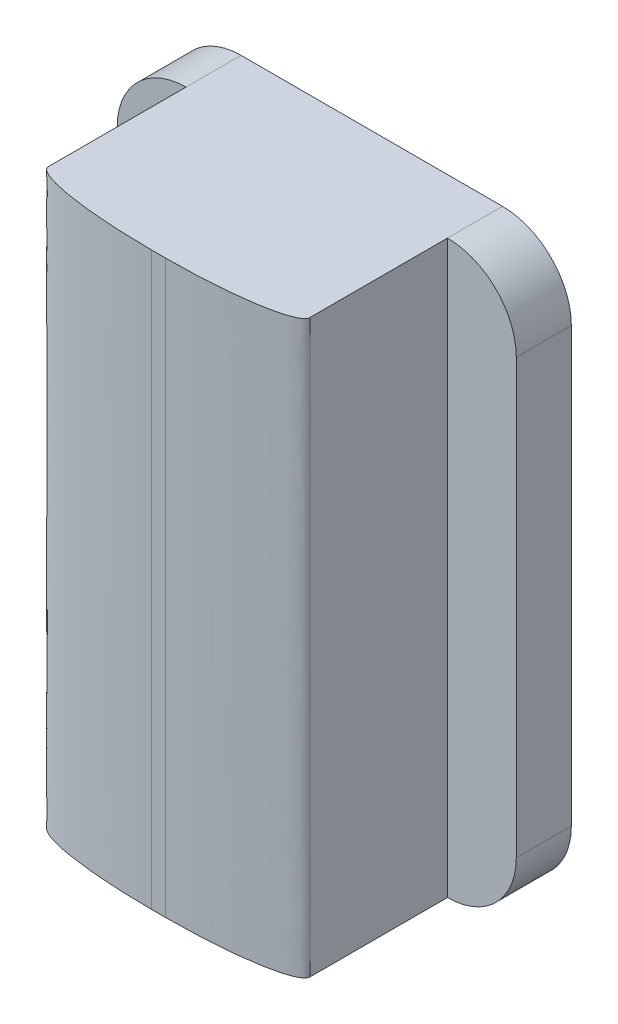
ISO-10303-21;
HEADER;
FILE_DESCRIPTION(('STEP AP214'),'2;1');
FILE_NAME('part.step','',(''),(''),'','','');
FILE_SCHEMA(('AUTOMOTIVE_DESIGN { 1 0 10303 214 1 1 1 1 }'));
ENDSEC;
DATA;
#1=APPLICATION_CONTEXT('core data for automotive mechanical design processes');
#2=APPLICATION_PROTOCOL_DEFINITION('international standard','automotive_design',2000,#1);
#3=PRODUCT_CONTEXT('',#1,'mechanical');
#4=PRODUCT('Part','Part','',(#3));
#5=PRODUCT_RELATED_PRODUCT_CATEGORY('part','',(#4));
#6=PRODUCT_DEFINITION_FORMATION('','',#4);
#7=PRODUCT_DEFINITION_CONTEXT('part definition',#1,'design');
#8=PRODUCT_DEFINITION('design','',#6,#7);
#9=PRODUCT_DEFINITION_SHAPE('','',#8);
#10=(LENGTH_UNIT() NAMED_UNIT(*) SI_UNIT(.MILLI.,.METRE.));
#11=(NAMED_UNIT(*) PLANE_ANGLE_UNIT() SI_UNIT($,.RADIAN.));
#12=(NAMED_UNIT(*) SI_UNIT($,.STERADIAN.) SOLID_ANGLE_UNIT());
#13=UNCERTAINTY_MEASURE_WITH_UNIT(LENGTH_MEASURE(1.E-05),#10,'distance_accuracy_value','');
#14=(GEOMETRIC_REPRESENTATION_CONTEXT(3) GLOBAL_UNCERTAINTY_ASSIGNED_CONTEXT((#13)) GLOBAL_UNIT_ASSIGNED_CONTEXT((#10,
#11,#12)) REPRESENTATION_CONTEXT('',''));
#15=CARTESIAN_POINT('',(0.,0.,0.));
#16=DIRECTION('',(0.,0.,1.));
#17=DIRECTION('',(1.,0.,0.));
#18=AXIS2_PLACEMENT_3D('',#15,#16,#17);
#19=CARTESIAN_POINT('',(2.5,-78.2729999997179,3.1));
#20=DIRECTION('',(-1.,0.,0.));
#21=DIRECTION('',(0.,-1.,0.));
#22=AXIS2_PLACEMENT_3D('',#19,#20,#21);
#23=PLANE('',#22);
#24=DIRECTION('',(0.,0.,-1.));
#25=VECTOR('',#24,1.);
#26=CARTESIAN_POINT('',(2.5,-65.8229986893806,3.1));
#27=LINE('',#26,#25);
#28=CARTESIAN_POINT('',(2.5,-65.8229986893806,2.8));
#29=VERTEX_POINT('',#28);
#30=CARTESIAN_POINT('',(2.5,-65.8229986893806,0.800000000000001));
#31=VERTEX_POINT('',#30);
#32=EDGE_CURVE('E243',#29,#31,#27,.T.);
#33=ORIENTED_EDGE('',*,*,#32,.F.);
#34=CARTESIAN_POINT('',(2.5,-78.2729999997179,2.8));
#35=CARTESIAN_POINT('',(2.5,-72.7396660840124,2.8));
#36=CARTESIAN_POINT('',(2.5,-67.2063321683071,2.8));
#37=CARTESIAN_POINT('',(2.5,-61.6729982526016,2.8));
#38=(BOUNDED_CURVE() B_SPLINE_CURVE(3,(#34,#35,#36,#37),.UNSPECIFIED.,.F.,
.F.) B_SPLINE_CURVE_WITH_KNOTS((4,4),(-0.0166000017471164,0.),
.UNSPECIFIED.) CURVE() GEOMETRIC_REPRESENTATION_ITEM() RATIONAL_B_SPLINE_CURVE((1.,1.,1.,1.)) REPRESENTATION_ITEM(''));
#39=CARTESIAN_POINT('',(2.5,-74.1229995629388,2.8));
#40=VERTEX_POINT('',#39);
#41=EDGE_CURVE('E157',#29,#40,#38,.F.);
#42=ORIENTED_EDGE('',*,*,#41,.T.);
#43=DIRECTION('',(0.,0.,1.));
#44=VECTOR('',#43,1.);
#45=CARTESIAN_POINT('',(2.5,-74.1229995629388,3.1));
#46=LINE('',#45,#44);
#47=CARTESIAN_POINT('',(2.5,-74.1229995629388,0.800000000000001));
#48=VERTEX_POINT('',#47);
#49=EDGE_CURVE('E135',#48,#40,#46,.T.);
#50=ORIENTED_EDGE('',*,*,#49,.F.);
#51=DIRECTION('',(0.,-1.,0.));
#52=VECTOR('',#51,1.);
#53=CARTESIAN_POINT('',(2.5,-78.2729999997179,0.8));
#54=LINE('',#53,#52);
#55=EDGE_CURVE('E275',#31,#48,#54,.T.);
#56=ORIENTED_EDGE('',*,*,#55,.F.);
#57=EDGE_LOOP('',(#33,#42,#50,#56));
#58=FACE_BOUND('',#57,.T.);
#59=ADVANCED_FACE('F40',(#58),#23,.F.);
#60=CARTESIAN_POINT('',(-1.3,-78.2729999997179,3.1));
#61=DIRECTION('',(1.,0.,0.));
#62=DIRECTION('',(0.,0.,-1.));
#63=AXIS2_PLACEMENT_3D('',#60,#61,#62);
#64=PLANE('',#63);
#65=DIRECTION('',(0.,0.,1.));
#66=VECTOR('',#65,1.);
#67=CARTESIAN_POINT('',(-1.3,-65.8229986893806,3.1));
#68=LINE('',#67,#66);
#69=CARTESIAN_POINT('',(-1.3,-65.8229986893806,0.8));
#70=VERTEX_POINT('',#69);
#71=CARTESIAN_POINT('',(-1.3,-65.8229986893806,2.8));
#72=VERTEX_POINT('',#71);
#73=EDGE_CURVE('E253',#70,#72,#68,.T.);
#74=ORIENTED_EDGE('',*,*,#73,.F.);
#75=DIRECTION('',(0.,1.,0.));
#76=VECTOR('',#75,1.);
#77=CARTESIAN_POINT('',(-1.3,-78.2729999997179,0.8));
#78=LINE('',#77,#76);
#79=CARTESIAN_POINT('',(-1.3,-74.1229995629388,0.8));
#80=VERTEX_POINT('',#79);
#81=EDGE_CURVE('E282',#80,#70,#78,.T.);
#82=ORIENTED_EDGE('',*,*,#81,.F.);
#83=DIRECTION('',(0.,0.,-1.));
#84=VECTOR('',#83,1.);
#85=CARTESIAN_POINT('',(-1.3,-74.1229995629388,3.1));
#86=LINE('',#85,#84);
#87=CARTESIAN_POINT('',(-1.3,-74.1229995629388,2.8));
#88=VERTEX_POINT('',#87);
#89=EDGE_CURVE('E234',#88,#80,#86,.T.);
#90=ORIENTED_EDGE('',*,*,#89,.F.);
#91=CARTESIAN_POINT('',(-1.3,-61.6729982526016,2.8));
#92=CARTESIAN_POINT('',(-1.3,-67.2063321683071,2.8));
#93=CARTESIAN_POINT('',(-1.3,-72.7396660840124,2.8));
#94=CARTESIAN_POINT('',(-1.3,-78.2729999997179,2.8));
#95=(BOUNDED_CURVE() B_SPLINE_CURVE(3,(#91,#92,#93,#94),.UNSPECIFIED.,.F.,
.F.) B_SPLINE_CURVE_WITH_KNOTS((4,4),(0.,0.0166000017471164),
.UNSPECIFIED.) CURVE() GEOMETRIC_REPRESENTATION_ITEM() RATIONAL_B_SPLINE_CURVE((1.,1.,1.,1.)) REPRESENTATION_ITEM(''));
#96=EDGE_CURVE('E319',#88,#72,#95,.F.);
#97=ORIENTED_EDGE('',*,*,#96,.T.);
#98=EDGE_LOOP('',(#74,#82,#90,#97));
#99=FACE_BOUND('',#98,.T.);
#100=ADVANCED_FACE('F299',(#99),#64,.F.);
#101=CARTESIAN_POINT('',(0.600000000000001,-78.2729999997179,3.1));
#102=DIRECTION('',(0.,0.,1.));
#103=DIRECTION('',(1.,0.,0.));
#104=AXIS2_PLACEMENT_3D('',#101,#102,#103);
#105=PLANE('',#104);
#106=CARTESIAN_POINT('',(0.7,-61.6729982526016,3.1));
#107=CARTESIAN_POINT('',(0.7,-67.2063321683071,3.1));
#108=CARTESIAN_POINT('',(0.700000000000001,-72.7396660840124,3.1));
#109=CARTESIAN_POINT('',(0.700000000000001,-78.2729999997179,3.1));
#110=(BOUNDED_CURVE() B_SPLINE_CURVE(3,(#106,#107,#108,#109),.UNSPECIFIED.,.F.,
.F.) B_SPLINE_CURVE_WITH_KNOTS((4,4),(-0.0166000017471164,0.),
.UNSPECIFIED.) CURVE() GEOMETRIC_REPRESENTATION_ITEM() RATIONAL_B_SPLINE_CURVE((1.,1.,1.,1.)) REPRESENTATION_ITEM(''));
#111=CARTESIAN_POINT('',(0.700000000000001,-74.1229995629388,3.1));
#112=VERTEX_POINT('',#111);
#113=CARTESIAN_POINT('',(0.7,-65.8229986893807,3.1));
#114=VERTEX_POINT('',#113);
#115=EDGE_CURVE('E148',#112,#114,#110,.F.);
#116=ORIENTED_EDGE('',*,*,#115,.T.);
#117=DIRECTION('',(-1.,0.,0.));
#118=VECTOR('',#117,1.);
#119=CARTESIAN_POINT('',(0.600000000000001,-65.8229986893806,3.1));
#120=LINE('',#119,#118);
#121=CARTESIAN_POINT('',(0.5,-65.8229986893806,3.1));
#122=VERTEX_POINT('',#121);
#123=EDGE_CURVE('E241',#114,#122,#120,.T.);
#124=ORIENTED_EDGE('',*,*,#123,.T.);
#125=CARTESIAN_POINT('',(0.5,-78.2729999997179,3.1));
#126=CARTESIAN_POINT('',(0.5,-72.7396660840124,3.1));
#127=CARTESIAN_POINT('',(0.5,-67.2063321683071,3.1));
#128=CARTESIAN_POINT('',(0.5,-61.6729982526016,3.1));
#129=(BOUNDED_CURVE() B_SPLINE_CURVE(3,(#125,#126,#127,#128),.UNSPECIFIED.,.F.,
.F.) B_SPLINE_CURVE_WITH_KNOTS((4,4),(0.,0.0166000017471164),
.UNSPECIFIED.) CURVE() GEOMETRIC_REPRESENTATION_ITEM() RATIONAL_B_SPLINE_CURVE((1.,1.,1.,1.)) REPRESENTATION_ITEM(''));
#130=CARTESIAN_POINT('',(0.5,-74.1229995629388,3.1));
#131=VERTEX_POINT('',#130);
#132=EDGE_CURVE('E151',#122,#131,#129,.F.);
#133=ORIENTED_EDGE('',*,*,#132,.T.);
#134=DIRECTION('',(1.,0.,0.));
#135=VECTOR('',#134,1.);
#136=CARTESIAN_POINT('',(0.600000000000001,-74.1229995629388,3.1));
#137=LINE('',#136,#135);
#138=EDGE_CURVE('E132',#131,#112,#137,.T.);
#139=ORIENTED_EDGE('',*,*,#138,.T.);
#140=EDGE_LOOP('',(#116,#124,#133,#139));
#141=FACE_BOUND('',#140,.T.);
#142=ADVANCED_FACE('F146',(#141),#105,.T.);
#143=CARTESIAN_POINT('',(0.600000000000001,-78.2729999997179,0.8));
#144=DIRECTION('',(0.,0.,-1.));
#145=DIRECTION('',(-1.,0.,0.));
#146=AXIS2_PLACEMENT_3D('',#143,#144,#145);
#147=PLANE('',#146);
#148=ORIENTED_EDGE('',*,*,#81,.T.);
#149=CARTESIAN_POINT('',(-1.3,-66.8229986893806,0.8));
#150=DIRECTION('',(0.,0.,-1.));
#151=DIRECTION('',(-1.,0.,0.));
#152=AXIS2_PLACEMENT_3D('',#149,#150,#151);
#153=CIRCLE('',#152,1.);
#154=CARTESIAN_POINT('',(-2.3,-66.8229986893806,0.8));
#155=VERTEX_POINT('',#154);
#156=EDGE_CURVE('E12',#70,#155,#153,.F.);
#157=ORIENTED_EDGE('',*,*,#156,.T.);
#158=DIRECTION('',(0.,1.,0.));
#159=VECTOR('',#158,1.);
#160=CARTESIAN_POINT('',(-2.3,-78.2729999997179,0.8));
#161=LINE('',#160,#159);
#162=CARTESIAN_POINT('',(-2.3,-73.1229995629388,0.8));
#163=VERTEX_POINT('',#162);
#164=EDGE_CURVE('E269',#163,#155,#161,.T.);
#165=ORIENTED_EDGE('',*,*,#164,.F.);
#166=CARTESIAN_POINT('',(-1.3,-73.1229995629388,0.8));
#167=DIRECTION('',(0.,0.,-1.));
#168=DIRECTION('',(-1.,0.,0.));
#169=AXIS2_PLACEMENT_3D('',#166,#167,#168);
#170=CIRCLE('',#169,1.);
#171=EDGE_CURVE('E48',#163,#80,#170,.F.);
#172=ORIENTED_EDGE('',*,*,#171,.T.);
#173=EDGE_LOOP('',(#148,#157,#165,#172));
#174=FACE_BOUND('',#173,.T.);
#175=ADVANCED_FACE('F298',(#174),#147,.F.);
#176=ORIENTED_EDGE('',*,*,#55,.T.);
#177=CARTESIAN_POINT('',(2.5,-73.1229995629388,0.8));
#178=DIRECTION('',(0.,0.,-1.));
#179=DIRECTION('',(-1.,0.,0.));
#180=AXIS2_PLACEMENT_3D('',#177,#178,#179);
#181=CIRCLE('',#180,1.);
#182=CARTESIAN_POINT('',(3.5,-73.1229995629388,0.8));
#183=VERTEX_POINT('',#182);
#184=EDGE_CURVE('E337',#48,#183,#181,.F.);
#185=ORIENTED_EDGE('',*,*,#184,.T.);
#186=DIRECTION('',(0.,-1.,0.));
#187=VECTOR('',#186,1.);
#188=CARTESIAN_POINT('',(3.5,-61.6729982526016,0.8));
#189=LINE('',#188,#187);
#190=CARTESIAN_POINT('',(3.5,-66.8229986893806,0.8));
#191=VERTEX_POINT('',#190);
#192=EDGE_CURVE('E271',#191,#183,#189,.T.);
#193=ORIENTED_EDGE('',*,*,#192,.F.);
#194=CARTESIAN_POINT('',(2.5,-66.8229986893806,0.8));
#195=DIRECTION('',(0.,0.,-1.));
#196=DIRECTION('',(-1.,0.,0.));
#197=AXIS2_PLACEMENT_3D('',#194,#195,#196);
#198=CIRCLE('',#197,1.);
#199=EDGE_CURVE('E339',#191,#31,#198,.F.);
#200=ORIENTED_EDGE('',*,*,#199,.T.);
#201=EDGE_LOOP('',(#176,#185,#193,#200));
#202=FACE_BOUND('',#201,.T.);
#203=ADVANCED_FACE('F406',(#202),#147,.F.);
#204=CARTESIAN_POINT('',(3.5,-61.6729982526016,0.8));
#205=DIRECTION('',(1.,0.,0.));
#206=DIRECTION('',(0.,0.,-1.));
#207=AXIS2_PLACEMENT_3D('',#204,#205,#206);
#208=PLANE('',#207);
#209=ORIENTED_EDGE('',*,*,#192,.T.);
#210=DIRECTION('',(0.,0.,-1.));
#211=VECTOR('',#210,1.);
#212=CARTESIAN_POINT('',(3.5,-73.1229995629388,0.8));
#213=LINE('',#212,#211);
#214=CARTESIAN_POINT('',(3.5,-73.1229995629388,0.));
#215=VERTEX_POINT('',#214);
#216=EDGE_CURVE('E353',#183,#215,#213,.T.);
#217=ORIENTED_EDGE('',*,*,#216,.T.);
#218=DIRECTION('',(0.,-1.,0.));
#219=VECTOR('',#218,1.);
#220=CARTESIAN_POINT('',(3.5,-61.6729982526016,0.));
#221=LINE('',#220,#219);
#222=CARTESIAN_POINT('',(3.5,-66.8229986893806,0.));
#223=VERTEX_POINT('',#222);
#224=EDGE_CURVE('E272',#223,#215,#221,.T.);
#225=ORIENTED_EDGE('',*,*,#224,.F.);
#226=DIRECTION('',(0.,0.,-1.));
#227=VECTOR('',#226,1.);
#228=CARTESIAN_POINT('',(3.5,-66.8229986893806,0.8));
#229=LINE('',#228,#227);
#230=EDGE_CURVE('E356',#223,#191,#229,.F.);
#231=ORIENTED_EDGE('',*,*,#230,.T.);
#232=EDGE_LOOP('',(#209,#217,#225,#231));
#233=FACE_BOUND('',#232,.T.);
#234=ADVANCED_FACE('F401',(#233),#208,.T.);
#235=CARTESIAN_POINT('',(-2.3,-78.2729999997179,0.8));
#236=DIRECTION('',(-1.,0.,0.));
#237=DIRECTION('',(0.,-1.,0.));
#238=AXIS2_PLACEMENT_3D('',#235,#236,#237);
#239=PLANE('',#238);
#240=ORIENTED_EDGE('',*,*,#164,.T.);
#241=DIRECTION('',(0.,0.,-1.));
#242=VECTOR('',#241,1.);
#243=CARTESIAN_POINT('',(-2.3,-66.8229986893806,0.8));
#244=LINE('',#243,#242);
#245=CARTESIAN_POINT('',(-2.3,-66.8229986893806,0.));
#246=VERTEX_POINT('',#245);
#247=EDGE_CURVE('E328',#155,#246,#244,.T.);
#248=ORIENTED_EDGE('',*,*,#247,.T.);
#249=DIRECTION('',(0.,1.,0.));
#250=VECTOR('',#249,1.);
#251=CARTESIAN_POINT('',(-2.3,-78.2729999997179,0.));
#252=LINE('',#251,#250);
#253=CARTESIAN_POINT('',(-2.3,-73.1229995629388,0.));
#254=VERTEX_POINT('',#253);
#255=EDGE_CURVE('E268',#254,#246,#252,.T.);
#256=ORIENTED_EDGE('',*,*,#255,.F.);
#257=DIRECTION('',(0.,0.,-1.));
#258=VECTOR('',#257,1.);
#259=CARTESIAN_POINT('',(-2.3,-73.1229995629388,0.8));
#260=LINE('',#259,#258);
#261=EDGE_CURVE('E60',#254,#163,#260,.F.);
#262=ORIENTED_EDGE('',*,*,#261,.T.);
#263=EDGE_LOOP('',(#240,#248,#256,#262));
#264=FACE_BOUND('',#263,.T.);
#265=ADVANCED_FACE('F300',(#264),#239,.T.);
#266=CARTESIAN_POINT('',(0.600000000000001,-78.2729999997179,0.));
#267=DIRECTION('',(0.,0.,1.));
#268=DIRECTION('',(1.,0.,0.));
#269=AXIS2_PLACEMENT_3D('',#266,#267,#268);
#270=PLANE('',#269);
#271=CARTESIAN_POINT('',(0.6,-69.9729991261597,0.));
#272=DIRECTION('',(0.,0.,1.));
#273=DIRECTION('',(1.,0.,0.));
#274=AXIS2_PLACEMENT_3D('',#271,#272,#273);
#275=CIRCLE('',#274,1.99674942128283);
#276=CARTESIAN_POINT('',(2.59674942128283,-69.9729991261597,0.));
#277=VERTEX_POINT('',#276);
#278=EDGE_CURVE('E366',#277,#277,#275,.T.);
#279=ORIENTED_EDGE('',*,*,#278,.T.);
#280=EDGE_LOOP('',(#279));
#281=FACE_BOUND('',#280,.T.);
#282=ORIENTED_EDGE('',*,*,#224,.T.);
#283=CARTESIAN_POINT('',(2.5,-73.1229995629388,0.));
#284=DIRECTION('',(0.,0.,1.));
#285=DIRECTION('',(1.,0.,0.));
#286=AXIS2_PLACEMENT_3D('',#283,#284,#285);
#287=CIRCLE('',#286,1.);
#288=CARTESIAN_POINT('',(2.5,-74.1229995629388,0.));
#289=VERTEX_POINT('',#288);
#290=EDGE_CURVE('E346',#215,#289,#287,.F.);
#291=ORIENTED_EDGE('',*,*,#290,.T.);
#292=DIRECTION('',(1.,0.,0.));
#293=VECTOR('',#292,1.);
#294=CARTESIAN_POINT('',(0.600000000000001,-74.1229995629388,0.));
#295=LINE('',#294,#293);
#296=CARTESIAN_POINT('',(-1.3,-74.1229995629388,0.));
#297=VERTEX_POINT('',#296);
#298=EDGE_CURVE('E237',#297,#289,#295,.T.);
#299=ORIENTED_EDGE('',*,*,#298,.F.);
#300=CARTESIAN_POINT('',(-1.3,-73.1229995629388,0.));
#301=DIRECTION('',(0.,0.,1.));
#302=DIRECTION('',(1.,0.,0.));
#303=AXIS2_PLACEMENT_3D('',#300,#301,#302);
#304=CIRCLE('',#303,1.);
#305=EDGE_CURVE('E351',#297,#254,#304,.F.);
#306=ORIENTED_EDGE('',*,*,#305,.T.);
#307=ORIENTED_EDGE('',*,*,#255,.T.);
#308=CARTESIAN_POINT('',(-1.3,-66.8229986893806,0.));
#309=DIRECTION('',(0.,0.,1.));
#310=DIRECTION('',(1.,0.,0.));
#311=AXIS2_PLACEMENT_3D('',#308,#309,#310);
#312=CIRCLE('',#311,1.);
#313=CARTESIAN_POINT('',(-1.3,-65.8229986893806,0.));
#314=VERTEX_POINT('',#313);
#315=EDGE_CURVE('E329',#246,#314,#312,.F.);
#316=ORIENTED_EDGE('',*,*,#315,.T.);
#317=DIRECTION('',(-1.,0.,0.));
#318=VECTOR('',#317,1.);
#319=CARTESIAN_POINT('',(0.600000000000001,-65.8229986893806,0.));
#320=LINE('',#319,#318);
#321=CARTESIAN_POINT('',(2.5,-65.8229986893806,0.));
#322=VERTEX_POINT('',#321);
#323=EDGE_CURVE('E260',#322,#314,#320,.T.);
#324=ORIENTED_EDGE('',*,*,#323,.F.);
#325=CARTESIAN_POINT('',(2.5,-66.8229986893806,0.));
#326=DIRECTION('',(0.,0.,1.));
#327=DIRECTION('',(1.,0.,0.));
#328=AXIS2_PLACEMENT_3D('',#325,#326,#327);
#329=CIRCLE('',#328,1.);
#330=EDGE_CURVE('E348',#322,#223,#329,.F.);
#331=ORIENTED_EDGE('',*,*,#330,.T.);
#332=EDGE_LOOP('',(#282,#291,#299,#306,#307,#316,#324,#331));
#333=FACE_BOUND('',#332,.T.);
#334=ADVANCED_FACE('F302',(#281,#333),#270,.F.);
#335=CARTESIAN_POINT('',(-1.3,-78.2729999997179,2.8));
#336=CARTESIAN_POINT('',(-1.3,-72.7396660840124,2.8));
#337=CARTESIAN_POINT('',(-1.3,-67.2063321683071,2.8));
#338=CARTESIAN_POINT('',(-1.3,-61.6729982526016,2.8));
#339=CARTESIAN_POINT('',(-1.3,-78.2729999997179,3.1));
#340=CARTESIAN_POINT('',(-1.3,-72.7396660840124,3.1));
#341=CARTESIAN_POINT('',(-1.3,-67.2063321683071,3.1));
#342=CARTESIAN_POINT('',(-1.3,-61.6729982526016,3.1));
#343=CARTESIAN_POINT('',(0.5,-78.2729999997179,3.1));
#344=CARTESIAN_POINT('',(0.5,-72.7396660840124,3.1));
#345=CARTESIAN_POINT('',(0.5,-67.2063321683071,3.1));
#346=CARTESIAN_POINT('',(0.5,-61.6729982526016,3.1));
#347=(BOUNDED_SURFACE() B_SPLINE_SURFACE(2,3,((#335,#336,#337,#338),(#339,#340,#341,#342),(#343,
#344,#345,#346)),.UNSPECIFIED.,.F.,.F.,.F.) B_SPLINE_SURFACE_WITH_KNOTS((3,3),(4,4),(0.,1.),(0.,
0.0166000017471164),
.UNSPECIFIED.) GEOMETRIC_REPRESENTATION_ITEM() RATIONAL_B_SPLINE_SURFACE(((1.,1.,1.,1.),
(0.707106781186548,0.707106781186548,0.707106781186548,0.707106781186548),(1.,1.,1.,1.))) REPRESENTATION_ITEM('') SURFACE());
#348=CARTESIAN_POINT('',(0.5,-65.8229986893806,3.1));
#349=CARTESIAN_POINT('',(0.425049685425084,-65.8229986893806,3.09998608157692));
#350=CARTESIAN_POINT('',(0.35009761714702,-65.8229986893806,3.09921898769901));
#351=CARTESIAN_POINT('',(0.200204582603327,-65.8229986893806,3.09608140188685));
#352=CARTESIAN_POINT('',(0.125263626652001,-65.8229986893806,3.09371042223646));
#353=CARTESIAN_POINT('',(-0.0248194114087012,-65.8229986893806,3.08725619041237));
#354=CARTESIAN_POINT('',(-0.0999612334572009,-65.8229986893806,3.08316674080968));
#355=CARTESIAN_POINT('',(-0.250104386357259,-65.8229986893806,3.07304372149303));
#356=CARTESIAN_POINT('',(-0.325105735380781,-65.8229986893806,3.06701042364484));
#357=CARTESIAN_POINT('',(-0.476499943818314,-65.8229986893806,3.05245039571743));
#358=CARTESIAN_POINT('',(-0.552888162386413,-65.8229986893806,3.04387298140523));
#359=CARTESIAN_POINT('',(-0.667106959776187,-65.8229986893806,3.02853481562303));
#360=CARTESIAN_POINT('',(-0.70510408535977,-65.8229986893806,3.02301280520243));
#361=CARTESIAN_POINT('',(-0.780934790830489,-65.8229986893806,3.01094862103606));
#362=CARTESIAN_POINT('',(-0.818768390079099,-65.8229986893806,3.00440657166322));
#363=CARTESIAN_POINT('',(-0.882564162525253,-65.8229986893806,2.99221536984239));
#364=CARTESIAN_POINT('',(-0.908592194803915,-65.8229986893806,2.98691221982135));
#365=CARTESIAN_POINT('',(-0.960478020273268,-65.8229986893806,2.97550390470444));
#366=CARTESIAN_POINT('',(-0.986335792165189,-65.8229986893806,2.96939864119696));
#367=CARTESIAN_POINT('',(-1.0297018535108,-65.8229986893806,2.95820790733595));
#368=CARTESIAN_POINT('',(-1.04728195127219,-65.8229986893806,2.95340433925841));
#369=CARTESIAN_POINT('',(-1.08224204918634,-65.8229986893806,2.9431536719556));
#370=CARTESIAN_POINT('',(-1.09962214512885,-65.8229986893806,2.93770689617981));
#371=CARTESIAN_POINT('',(-1.14071927947293,-65.8229986893806,2.92372438258495));
#372=CARTESIAN_POINT('',(-1.16431505897158,-65.8229986893806,2.9148043741863));
#373=CARTESIAN_POINT('',(-1.19848063706843,-65.8229986893806,2.89946581791641));
#374=CARTESIAN_POINT('',(-1.20952018988157,-65.8229986893806,2.89411321250674));
#375=CARTESIAN_POINT('',(-1.23105844805767,-65.8229986893806,2.88246054751609));
#376=CARTESIAN_POINT('',(-1.24155855002582,-65.8229986893806,2.87616311919136));
#377=CARTESIAN_POINT('',(-1.2603792366375,-65.8229986893806,2.86292636423213));
#378=CARTESIAN_POINT('',(-1.26880986324781,-65.8229986893806,2.85615659302166));
#379=CARTESIAN_POINT('',(-1.28016940561446,-65.8229986893806,2.84457829400693));
#380=CARTESIAN_POINT('',(-1.28376460270986,-65.8229986893806,2.84044323134203));
#381=CARTESIAN_POINT('',(-1.2901748747192,-65.8229986893806,2.83162087593423));
#382=CARTESIAN_POINT('',(-1.29299384610579,-65.8229986893806,2.82693651620243));
#383=CARTESIAN_POINT('',(-1.29764004833952,-65.8229986893806,2.81631707045853));
#384=CARTESIAN_POINT('',(-1.29929959465827,-65.8229986893806,2.81029885242983));
#385=CARTESIAN_POINT('',(-1.29994334008157,-65.8229986893806,2.80280638004768));
#386=CARTESIAN_POINT('',(-1.30000365552413,-65.8229986893806,2.80140322202149));
#387=CARTESIAN_POINT('',(-1.3,-65.8229986893806,2.8));
#388=B_SPLINE_CURVE_WITH_KNOTS('',3,(#348,#349,#350,#351,#352,#353,#354,#355,#356,#357,#358,
#359,#360,#361,#362,#363,#364,#365,#366,#367,#368,#369,#370,#371,#372,#373,#374,#375,#376,#377,
#378,#379,#380,#381,#382,#383,#384,#385,#386,#387),.UNSPECIFIED.,.F.,.F.,(4,2,2,2,2,2,2,2,2,2,2,
2,2,2,2,2,2,2,2,4),(0.,0.224849777939132,0.449767959870307,0.675504335971262,0.901209154376357,
1.13175292185409,1.24693213775565,1.36209732086859,1.44177659054707,1.52146564525096,
1.57612772854528,1.63076244007435,1.70631314966178,1.74308678949121,1.77975985603581,
1.81200081606849,1.82838142589269,1.84467824427803,1.8630089990025,1.86721829738157),.UNSPECIFIED.);
#389=EDGE_CURVE('E248',#122,#72,#388,.T.);
#390=CARTESIAN_POINT('',(-1.3,-74.1229995629388,2.8));
#391=CARTESIAN_POINT('',(-1.30002810450264,-74.1229995629388,2.80642916042709));
#392=CARTESIAN_POINT('',(-1.29876657842228,-74.1229995629388,2.81260010567821));
#393=CARTESIAN_POINT('',(-1.29377625983822,-74.1229995629388,2.8260293609798));
#394=CARTESIAN_POINT('',(-1.28942986155063,-74.1229995629388,2.83307208868653));
#395=CARTESIAN_POINT('',(-1.27975059783973,-74.1229995629388,2.84527056842014));
#396=CARTESIAN_POINT('',(-1.27453666014946,-74.1229995629388,2.85053725945646));
#397=CARTESIAN_POINT('',(-1.26344912046388,-74.1229995629388,2.86035013062521));
#398=CARTESIAN_POINT('',(-1.25757395582169,-74.1229995629389,2.86489454004674));
#399=CARTESIAN_POINT('',(-1.24144386819273,-74.1229995629389,2.87625181422161));
#400=CARTESIAN_POINT('',(-1.23085858465255,-74.1229995629388,2.88258114550185));
#401=CARTESIAN_POINT('',(-1.20916765262411,-74.1229995629388,2.89429132562493));
#402=CARTESIAN_POINT('',(-1.19806087559656,-74.1229995629388,2.89966998495813));
#403=CARTESIAN_POINT('',(-1.17549028893926,-74.1229995629388,2.90977057846778));
#404=CARTESIAN_POINT('',(-1.16402499530573,-74.1229995629388,2.91448916206757));
#405=CARTESIAN_POINT('',(-1.14091196775608,-74.1229995629388,2.92340622173588));
#406=CARTESIAN_POINT('',(-1.12926445366762,-74.1229995629388,2.92760527712854));
#407=CARTESIAN_POINT('',(-1.09026117971447,-74.1229995629388,2.94092813830139));
#408=CARTESIAN_POINT('',(-1.06260808139109,-74.1229995629388,2.94917769347295));
#409=CARTESIAN_POINT('',(-1.00691987324252,-74.1229995629388,2.9643150867674));
#410=CARTESIAN_POINT('',(-0.978884422597055,-74.1229995629388,2.97120161182166));
#411=CARTESIAN_POINT('',(-0.922676520404748,-74.1229995629388,2.98395657289038));
#412=CARTESIAN_POINT('',(-0.89450477317046,-74.1229995629388,2.98982813067455));
#413=CARTESIAN_POINT('',(-0.83802564686267,-74.1229995629388,3.0008009031018));
#414=CARTESIAN_POINT('',(-0.80971832560432,-74.1229995629389,3.00590242036285));
#415=CARTESIAN_POINT('',(-0.728764180894691,-74.1229995629389,3.01958199670097));
#416=CARTESIAN_POINT('',(-0.675989862440997,-74.1229995629388,3.02740546934536));
#417=CARTESIAN_POINT('',(-0.570224631707006,-74.1229995629388,3.04147382155664));
#418=CARTESIAN_POINT('',(-0.517233667387975,-74.1229995629388,3.04771829607911));
#419=CARTESIAN_POINT('',(-0.357953364499333,-74.1229995629388,3.06456894375411));
#420=CARTESIAN_POINT('',(-0.251462702810037,-74.1229995629388,3.07327598328314));
#421=CARTESIAN_POINT('',(-0.0373989238489662,-74.1229995629388,3.08695299791594));
#422=CARTESIAN_POINT('',(0.0701760198560567,-74.1229995629388,3.09189240869082));
#423=CARTESIAN_POINT('',(0.231484484343403,-74.1229995629388,3.09678201386009));
#424=CARTESIAN_POINT('',(0.285182479117682,-74.1229995629388,3.09799201489744));
#425=CARTESIAN_POINT('',(0.392586834151519,-74.1229995629388,3.09959961885337));
#426=CARTESIAN_POINT('',(0.446293193535343,-74.1229995629388,3.09999728000829));
#427=CARTESIAN_POINT('',(0.5,-74.1229995629388,3.1));
#428=B_SPLINE_CURVE_WITH_KNOTS('',3,(#390,#391,#392,#393,#394,#395,#396,#397,#398,#399,#400,
#401,#402,#403,#404,#405,#406,#407,#408,#409,#410,#411,#412,#413,#414,#415,#416,#417,#418,#419,
#420,#421,#422,#423,#424,#425,#426,#427),.UNSPECIFIED.,.F.,.F.,(4,2,2,2,2,2,2,2,2,2,2,2,2,2,2,2,
2,2,4),(0.,0.0187643993675811,0.043059358501095,0.0652377684901309,0.0874697381663862,
0.124381773946432,0.161377745094211,0.198555178064192,0.235690773643645,0.32219564924716,
0.408783457595653,0.495100013629128,0.581382559332211,0.741398729554463,0.9014559055589,
1.22189190827917,1.54490053798837,1.70603000782261,1.86714792594141),.UNSPECIFIED.);
#429=EDGE_CURVE('E232',#88,#131,#428,.T.);
#430=ORIENTED_EDGE('',*,*,#132,.F.);
#431=ORIENTED_EDGE('',*,*,#389,.T.);
#432=ORIENTED_EDGE('',*,*,#96,.F.);
#433=ORIENTED_EDGE('',*,*,#429,.T.);
#434=EDGE_LOOP('',(#430,#431,#432,#433));
#435=FACE_BOUND('',#434,.T.);
#436=ADVANCED_FACE('F189',(#435),#347,.T.);
#437=CARTESIAN_POINT('',(2.5,-61.6729982526016,2.8));
#438=CARTESIAN_POINT('',(2.5,-67.2063321683071,2.8));
#439=CARTESIAN_POINT('',(2.5,-72.7396660840124,2.8));
#440=CARTESIAN_POINT('',(2.5,-78.2729999997179,2.8));
#441=CARTESIAN_POINT('',(2.5,-61.6729982526016,3.1));
#442=CARTESIAN_POINT('',(2.5000000000048,-67.2063321683071,3.1));
#443=CARTESIAN_POINT('',(2.5,-72.7396660840124,3.1));
#444=CARTESIAN_POINT('',(2.5,-78.2729999997179,3.1));
#445=CARTESIAN_POINT('',(0.7,-61.6729982526016,3.1));
#446=CARTESIAN_POINT('',(0.7,-67.2063321683071,3.1));
#447=CARTESIAN_POINT('',(0.700000000000001,-72.7396660840124,3.1));
#448=CARTESIAN_POINT('',(0.700000000000001,-78.2729999997179,3.1));
#449=(BOUNDED_SURFACE() B_SPLINE_SURFACE(2,3,((#437,#438,#439,#440),(#441,#442,#443,#444),(#445,
#446,#447,#448)),.UNSPECIFIED.,.F.,.F.,.F.) B_SPLINE_SURFACE_WITH_KNOTS((3,3),(4,4),(0.,1.),
(-0.0166000017471164,0.),
.UNSPECIFIED.) GEOMETRIC_REPRESENTATION_ITEM() RATIONAL_B_SPLINE_SURFACE(((1.,1.,1.,1.),
(0.707106781186547,0.707106781186547,0.707106781186548,0.707106781186548),(1.,1.,1.,1.))) REPRESENTATION_ITEM('') SURFACE());
#450=CARTESIAN_POINT('',(2.5,-65.8229986893806,2.8));
#451=CARTESIAN_POINT('',(2.50002810450269,-65.8229986893806,2.80642916042705));
#452=CARTESIAN_POINT('',(2.49876657842238,-65.8229986893807,2.81260010567815));
#453=CARTESIAN_POINT('',(2.49377625983844,-65.8229986893807,2.82602936097967));
#454=CARTESIAN_POINT('',(2.48942986155096,-65.8229986893807,2.83307208868636));
#455=CARTESIAN_POINT('',(2.47975059784027,-65.8229986893807,2.84527056841986));
#456=CARTESIAN_POINT('',(2.47453666015012,-65.8229986893806,2.85053725945611));
#457=CARTESIAN_POINT('',(2.4634491204648,-65.8229986893806,2.86035013062476));
#458=CARTESIAN_POINT('',(2.45757395582274,-65.8229986893806,2.86489454004624));
#459=CARTESIAN_POINT('',(2.44144386819421,-65.8229986893806,2.87625181422094));
#460=CARTESIAN_POINT('',(2.43085858465434,-65.8229986893806,2.88258114550108));
#461=CARTESIAN_POINT('',(2.40916765262653,-65.8229986893806,2.89429132562398));
#462=CARTESIAN_POINT('',(2.39806087559929,-65.8229986893806,2.89966998495709));
#463=CARTESIAN_POINT('',(2.37549028894263,-65.8229986893806,2.9097705784666));
#464=CARTESIAN_POINT('',(2.36402499530942,-65.8229986893806,2.91448916206632));
#465=CARTESIAN_POINT('',(2.34091196776042,-65.8229986893806,2.92340622173452));
#466=CARTESIAN_POINT('',(2.32926445367228,-65.8229986893806,2.92760527712712));
#467=CARTESIAN_POINT('',(2.29026117972029,-65.8229986893806,2.94092813829977));
#468=CARTESIAN_POINT('',(2.26260808139776,-65.8229986893806,2.94917769347121));
#469=CARTESIAN_POINT('',(2.2069198732509,-65.8229986893806,2.96431508676546));
#470=CARTESIAN_POINT('',(2.17888442260628,-65.8229986893806,2.97120161181963));
#471=CARTESIAN_POINT('',(2.12267652041568,-65.8229986893806,2.9839565728882));
#472=CARTESIAN_POINT('',(2.09450477318224,-65.8229986893806,2.98982813067231));
#473=CARTESIAN_POINT('',(2.03802564687615,-65.8229986893806,3.00080090309945));
#474=CARTESIAN_POINT('',(2.00971832561865,-65.8229986893806,3.00590242036047));
#475=CARTESIAN_POINT('',(1.92876418090929,-65.8229986893806,3.01958199669885));
#476=CARTESIAN_POINT('',(1.87598986245499,-65.8229986893806,3.02740546934348));
#477=CARTESIAN_POINT('',(1.77022463171979,-65.8229986893806,3.04147382155517));
#478=CARTESIAN_POINT('',(1.71723366740015,-65.8229986893806,3.04771829607782));
#479=CARTESIAN_POINT('',(1.55795336450965,-65.8229986893806,3.06456894375327));
#480=CARTESIAN_POINT('',(1.4514627028191,-65.8229986893807,3.07327598328251));
#481=CARTESIAN_POINT('',(1.23739892385547,-65.8229986893807,3.08695299791564));
#482=CARTESIAN_POINT('',(1.12982398014914,-65.8229986893806,3.09189240869064));
#483=CARTESIAN_POINT('',(0.968515515659832,-65.8229986893806,3.09678201386002));
#484=CARTESIAN_POINT('',(0.914817520884906,-65.8229986893806,3.0979920148974));
#485=CARTESIAN_POINT('',(0.807413165849775,-65.8229986893806,3.09959961885336));
#486=CARTESIAN_POINT('',(0.753706806465305,-65.8229986893806,3.09999728000829));
#487=CARTESIAN_POINT('',(0.700000000000001,-65.8229986893807,3.1));
#488=B_SPLINE_CURVE_WITH_KNOTS('',3,(#450,#451,#452,#453,#454,#455,#456,#457,#458,#459,#460,
#461,#462,#463,#464,#465,#466,#467,#468,#469,#470,#471,#472,#473,#474,#475,#476,#477,#478,#479,
#480,#481,#482,#483,#484,#485,#486,#487),.UNSPECIFIED.,.F.,.F.,(4,2,2,2,2,2,2,2,2,2,2,2,2,2,2,2,
2,2,4),(0.,0.018764399367484,0.0430593585007388,0.0652377684893838,0.0874697381652488,
0.124381773944337,0.161377745091156,0.198555178060171,0.235690773638661,0.322195649239634,
0.408783457585584,0.495100013616525,0.581382559317074,0.741398729541207,0.901455905547528,
1.22189190827159,1.54490053798473,1.70603000782091,1.86714792594166),.UNSPECIFIED.);
#489=EDGE_CURVE('E140',#29,#114,#488,.T.);
#490=CARTESIAN_POINT('',(0.700000000000001,-74.1229995629388,3.1));
#491=CARTESIAN_POINT('',(0.774950314574917,-74.1229995629388,3.09998608157692));
#492=CARTESIAN_POINT('',(0.849902382852981,-74.1229995629388,3.09921898769901));
#493=CARTESIAN_POINT('',(0.999795417396674,-74.1229995629388,3.09608140188685));
#494=CARTESIAN_POINT('',(1.074736373348,-74.1229995629388,3.09371042223646));
#495=CARTESIAN_POINT('',(1.2248194114087,-74.1229995629388,3.08725619041238));
#496=CARTESIAN_POINT('',(1.2999612334572,-74.1229995629388,3.08316674080969));
#497=CARTESIAN_POINT('',(1.45010438635726,-74.1229995629388,3.07304372149305));
#498=CARTESIAN_POINT('',(1.52510573538078,-74.1229995629389,3.06701042364486));
#499=CARTESIAN_POINT('',(1.67649994381831,-74.1229995629389,3.05245039571746));
#500=CARTESIAN_POINT('',(1.75288816238641,-74.1229995629388,3.04387298140526));
#501=CARTESIAN_POINT('',(1.86710695977619,-74.1229995629388,3.02853481562307));
#502=CARTESIAN_POINT('',(1.90510408535977,-74.1229995629388,3.02301280520248));
#503=CARTESIAN_POINT('',(1.98093479083049,-74.1229995629388,3.01094862103611));
#504=CARTESIAN_POINT('',(2.0187683900791,-74.1229995629388,3.00440657166327));
#505=CARTESIAN_POINT('',(2.08256416252524,-74.1229995629388,2.99221536984245));
#506=CARTESIAN_POINT('',(2.10859219480389,-74.1229995629388,2.98691221982141));
#507=CARTESIAN_POINT('',(2.16047802027322,-74.1229995629389,2.97550390470451));
#508=CARTESIAN_POINT('',(2.18633579216514,-74.1229995629389,2.96939864119704));
#509=CARTESIAN_POINT('',(2.22970185351073,-74.1229995629389,2.95820790733604));
#510=CARTESIAN_POINT('',(2.24728195127211,-74.1229995629389,2.9534043392585));
#511=CARTESIAN_POINT('',(2.28224204918625,-74.1229995629388,2.9431536719557));
#512=CARTESIAN_POINT('',(2.29962214512876,-74.1229995629388,2.93770689617992));
#513=CARTESIAN_POINT('',(2.34071927947282,-74.1229995629388,2.92372438258506));
#514=CARTESIAN_POINT('',(2.36431505897146,-74.1229995629389,2.91480437418643));
#515=CARTESIAN_POINT('',(2.3984806370683,-74.1229995629389,2.89946581791655));
#516=CARTESIAN_POINT('',(2.40952018988144,-74.1229995629388,2.8941132125069));
#517=CARTESIAN_POINT('',(2.43105844805752,-74.1229995629388,2.88246054751627));
#518=CARTESIAN_POINT('',(2.44155855002566,-74.1229995629388,2.87616311919155));
#519=CARTESIAN_POINT('',(2.46037923663734,-74.1229995629388,2.86292636423234));
#520=CARTESIAN_POINT('',(2.46880986324767,-74.1229995629389,2.85615659302188));
#521=CARTESIAN_POINT('',(2.48016940561435,-74.1229995629389,2.84457829400716));
#522=CARTESIAN_POINT('',(2.48376460270975,-74.1229995629388,2.84044323134226));
#523=CARTESIAN_POINT('',(2.49017487471911,-74.1229995629388,2.83162087593448));
#524=CARTESIAN_POINT('',(2.49299384610572,-74.1229995629388,2.82693651620268));
#525=CARTESIAN_POINT('',(2.49764004833948,-74.1229995629389,2.81631707045878));
#526=CARTESIAN_POINT('',(2.49929959465824,-74.1229995629389,2.81029885243009));
#527=CARTESIAN_POINT('',(2.49994334008157,-74.1229995629388,2.80280638004785));
#528=CARTESIAN_POINT('',(2.50000365552413,-74.1229995629388,2.80140322202157));
#529=CARTESIAN_POINT('',(2.5,-74.1229995629388,2.8));
#530=B_SPLINE_CURVE_WITH_KNOTS('',3,(#490,#491,#492,#493,#494,#495,#496,#497,#498,#499,#500,
#501,#502,#503,#504,#505,#506,#507,#508,#509,#510,#511,#512,#513,#514,#515,#516,#517,#518,#519,
#520,#521,#522,#523,#524,#525,#526,#527,#528,#529),.UNSPECIFIED.,.F.,.F.,(4,2,2,2,2,2,2,2,2,2,2,
2,2,2,2,2,2,2,2,4),(0.,0.224849777939133,0.449767959870308,0.675504335971261,0.901209154376355,
1.13175292185409,1.24693213775565,1.36209732086858,1.44177659054703,1.52146564525089,
1.57612772854518,1.63076244007423,1.70631314966164,1.74308678949103,1.7797598560356,
1.81200081606829,1.8283814258925,1.84467824427785,1.86300899900232,1.86721829738165),.UNSPECIFIED.);
#531=EDGE_CURVE('E128',#112,#40,#530,.T.);
#532=ORIENTED_EDGE('',*,*,#41,.F.);
#533=ORIENTED_EDGE('',*,*,#489,.T.);
#534=ORIENTED_EDGE('',*,*,#115,.F.);
#535=ORIENTED_EDGE('',*,*,#531,.T.);
#536=EDGE_LOOP('',(#532,#533,#534,#535));
#537=FACE_BOUND('',#536,.T.);
#538=ADVANCED_FACE('F156',(#537),#449,.T.);
#539=CARTESIAN_POINT('',(0.6,-69.9729991261597,-1.05));
#540=DIRECTION('',(0.,0.,1.));
#541=DIRECTION('',(1.,0.,0.));
#542=AXIS2_PLACEMENT_3D('',#539,#540,#541);
#543=CYLINDRICAL_SURFACE('',#542,1.09674942128283);
#544=CARTESIAN_POINT('',(0.6,-69.9729991261597,-0.9));
#545=DIRECTION('',(0.,0.,1.));
#546=DIRECTION('',(1.,0.,0.));
#547=AXIS2_PLACEMENT_3D('',#544,#545,#546);
#548=CIRCLE('',#547,1.09674942128283);
#549=CARTESIAN_POINT('',(1.69674942128283,-69.9729991261597,-0.9));
#550=VERTEX_POINT('',#549);
#551=EDGE_CURVE('E141',#550,#550,#548,.F.);
#552=ORIENTED_EDGE('',*,*,#551,.T.);
#553=EDGE_LOOP('',(#552));
#554=FACE_BOUND('',#553,.T.);
#555=CARTESIAN_POINT('',(0.6,-69.9729991261597,-1.05));
#556=DIRECTION('',(0.,0.,-1.));
#557=DIRECTION('',(-1.,0.,0.));
#558=AXIS2_PLACEMENT_3D('',#555,#556,#557);
#559=CIRCLE('',#558,1.09674942128283);
#560=CARTESIAN_POINT('',(-0.496749421282835,-69.9729991261597,-1.05));
#561=VERTEX_POINT('',#560);
#562=EDGE_CURVE('E265',#561,#561,#559,.T.);
#563=ORIENTED_EDGE('',*,*,#562,.F.);
#564=EDGE_LOOP('',(#563));
#565=FACE_BOUND('',#564,.T.);
#566=ADVANCED_FACE('F188',(#554,#565),#543,.T.);
#567=CARTESIAN_POINT('',(0.6,-69.9729991261597,-1.05));
#568=DIRECTION('',(0.,0.,-1.));
#569=DIRECTION('',(-1.,0.,0.));
#570=AXIS2_PLACEMENT_3D('',#567,#568,#569);
#571=PLANE('',#570);
#572=ORIENTED_EDGE('',*,*,#562,.T.);
#573=EDGE_LOOP('',(#572));
#574=FACE_BOUND('',#573,.T.);
#575=ADVANCED_FACE('F222',(#574),#571,.T.);
#576=CARTESIAN_POINT('',(0.6,-69.9729991261597,-0.9));
#577=DIRECTION('',(0.,0.,1.));
#578=DIRECTION('',(1.,0.,0.));
#579=AXIS2_PLACEMENT_3D('',#576,#577,#578);
#580=TOROIDAL_SURFACE('',#579,1.99674942128283,0.9);
#581=ORIENTED_EDGE('',*,*,#278,.F.);
#582=EDGE_LOOP('',(#581));
#583=FACE_BOUND('',#582,.T.);
#584=ORIENTED_EDGE('',*,*,#551,.F.);
#585=EDGE_LOOP('',(#584));
#586=FACE_BOUND('',#585,.T.);
#587=ADVANCED_FACE('F220',(#583,#586),#580,.F.);
#588=CARTESIAN_POINT('',(-2.3,-74.1229995629388,3.105));
#589=DIRECTION('',(0.,-1.,0.));
#590=DIRECTION('',(0.,0.,-1.));
#591=AXIS2_PLACEMENT_3D('',#588,#589,#590);
#592=PLANE('',#591);
#593=ORIENTED_EDGE('',*,*,#298,.T.);
#594=DIRECTION('',(0.,0.,-1.));
#595=VECTOR('',#594,1.);
#596=CARTESIAN_POINT('',(2.5,-74.1229995629388,3.105));
#597=LINE('',#596,#595);
#598=EDGE_CURVE('E341',#289,#48,#597,.F.);
#599=ORIENTED_EDGE('',*,*,#598,.T.);
#600=ORIENTED_EDGE('',*,*,#49,.T.);
#601=ORIENTED_EDGE('',*,*,#531,.F.);
#602=ORIENTED_EDGE('',*,*,#138,.F.);
#603=ORIENTED_EDGE('',*,*,#429,.F.);
#604=ORIENTED_EDGE('',*,*,#89,.T.);
#605=DIRECTION('',(0.,0.,-1.));
#606=VECTOR('',#605,1.);
#607=CARTESIAN_POINT('',(-1.3,-74.1229995629388,3.105));
#608=LINE('',#607,#606);
#609=EDGE_CURVE('E343',#80,#297,#608,.T.);
#610=ORIENTED_EDGE('',*,*,#609,.T.);
#611=EDGE_LOOP('',(#593,#599,#600,#601,#602,#603,#604,#610));
#612=FACE_BOUND('',#611,.T.);
#613=ADVANCED_FACE('F131',(#612),#592,.T.);
#614=CARTESIAN_POINT('',(-2.3,-65.8229986893806,3.105));
#615=DIRECTION('',(0.,1.,0.));
#616=DIRECTION('',(0.,0.,1.));
#617=AXIS2_PLACEMENT_3D('',#614,#615,#616);
#618=PLANE('',#617);
#619=ORIENTED_EDGE('',*,*,#32,.T.);
#620=DIRECTION('',(0.,0.,-1.));
#621=VECTOR('',#620,1.);
#622=CARTESIAN_POINT('',(2.5,-65.8229986893806,3.105));
#623=LINE('',#622,#621);
#624=EDGE_CURVE('E331',#31,#322,#623,.T.);
#625=ORIENTED_EDGE('',*,*,#624,.T.);
#626=ORIENTED_EDGE('',*,*,#323,.T.);
#627=DIRECTION('',(0.,0.,-1.));
#628=VECTOR('',#627,1.);
#629=CARTESIAN_POINT('',(-1.3,-65.8229986893806,3.105));
#630=LINE('',#629,#628);
#631=EDGE_CURVE('E326',#314,#70,#630,.F.);
#632=ORIENTED_EDGE('',*,*,#631,.T.);
#633=ORIENTED_EDGE('',*,*,#73,.T.);
#634=ORIENTED_EDGE('',*,*,#389,.F.);
#635=ORIENTED_EDGE('',*,*,#123,.F.);
#636=ORIENTED_EDGE('',*,*,#489,.F.);
#637=EDGE_LOOP('',(#619,#625,#626,#632,#633,#634,#635,#636));
#638=FACE_BOUND('',#637,.T.);
#639=ADVANCED_FACE('F219',(#638),#618,.T.);
#640=CARTESIAN_POINT('',(2.5,-73.1229995629388,0.8));
#641=DIRECTION('',(0.,0.,-1.));
#642=DIRECTION('',(-1.,0.,0.));
#643=AXIS2_PLACEMENT_3D('',#640,#641,#642);
#644=CYLINDRICAL_SURFACE('',#643,1.);
#645=ORIENTED_EDGE('',*,*,#184,.F.);
#646=ORIENTED_EDGE('',*,*,#598,.F.);
#647=ORIENTED_EDGE('',*,*,#290,.F.);
#648=ORIENTED_EDGE('',*,*,#216,.F.);
#649=EDGE_LOOP('',(#645,#646,#647,#648));
#650=FACE_BOUND('',#649,.T.);
#651=ADVANCED_FACE('F399',(#650),#644,.T.);
#652=CARTESIAN_POINT('',(2.5,-66.8229986893806,3.105));
#653=DIRECTION('',(0.,0.,-1.));
#654=DIRECTION('',(-1.,0.,0.));
#655=AXIS2_PLACEMENT_3D('',#652,#653,#654);
#656=CYLINDRICAL_SURFACE('',#655,1.);
#657=ORIENTED_EDGE('',*,*,#199,.F.);
#658=ORIENTED_EDGE('',*,*,#230,.F.);
#659=ORIENTED_EDGE('',*,*,#330,.F.);
#660=ORIENTED_EDGE('',*,*,#624,.F.);
#661=EDGE_LOOP('',(#657,#658,#659,#660));
#662=FACE_BOUND('',#661,.T.);
#663=ADVANCED_FACE('F408',(#662),#656,.T.);
#664=CARTESIAN_POINT('',(-1.3,-66.8229986893806,0.8));
#665=DIRECTION('',(0.,0.,-1.));
#666=DIRECTION('',(-1.,0.,0.));
#667=AXIS2_PLACEMENT_3D('',#664,#665,#666);
#668=CYLINDRICAL_SURFACE('',#667,1.);
#669=ORIENTED_EDGE('',*,*,#156,.F.);
#670=ORIENTED_EDGE('',*,*,#631,.F.);
#671=ORIENTED_EDGE('',*,*,#315,.F.);
#672=ORIENTED_EDGE('',*,*,#247,.F.);
#673=EDGE_LOOP('',(#669,#670,#671,#672));
#674=FACE_BOUND('',#673,.T.);
#675=ADVANCED_FACE('F325',(#674),#668,.T.);
#676=CARTESIAN_POINT('',(-1.3,-73.1229995629388,3.105));
#677=DIRECTION('',(0.,0.,-1.));
#678=DIRECTION('',(-1.,0.,0.));
#679=AXIS2_PLACEMENT_3D('',#676,#677,#678);
#680=CYLINDRICAL_SURFACE('',#679,1.);
#681=ORIENTED_EDGE('',*,*,#171,.F.);
#682=ORIENTED_EDGE('',*,*,#261,.F.);
#683=ORIENTED_EDGE('',*,*,#305,.F.);
#684=ORIENTED_EDGE('',*,*,#609,.F.);
#685=EDGE_LOOP('',(#681,#682,#683,#684));
#686=FACE_BOUND('',#685,.T.);
#687=ADVANCED_FACE('F42',(#686),#680,.T.);
#688=CLOSED_SHELL('',(#59,#100,#142,#175,#203,#234,#265,#334,#436,#538,#566,#575,#587,#613,#639,
#651,#663,#675,#687));
#689=MANIFOLD_SOLID_BREP('B2',#688);
#690=ADVANCED_BREP_SHAPE_REPRESENTATION('',(#18,#689),#14);
#691=SHAPE_DEFINITION_REPRESENTATION(#9,#690);
ENDSEC;
END-ISO-10303-21;
